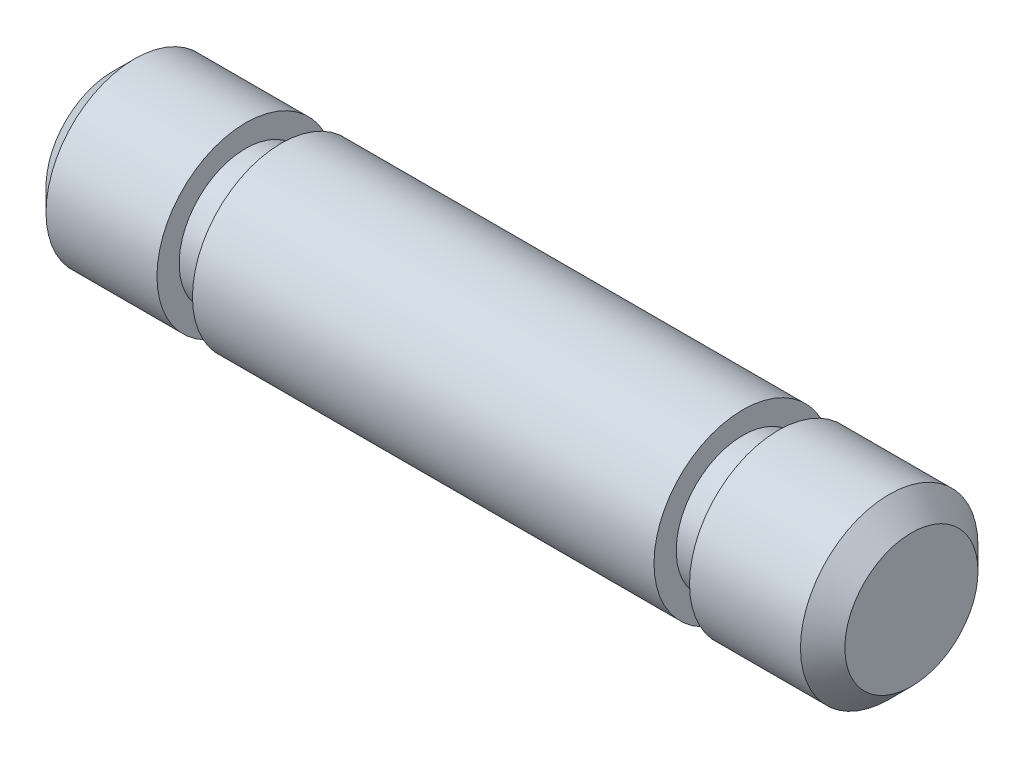
ISO-10303-21;
HEADER;
FILE_DESCRIPTION(('STEP AP214'),'2;1');
FILE_NAME('part.step','',(''),(''),'','','');
FILE_SCHEMA(('AUTOMOTIVE_DESIGN { 1 0 10303 214 1 1 1 1 }'));
ENDSEC;
DATA;
#1=APPLICATION_CONTEXT('core data for automotive mechanical design processes');
#2=APPLICATION_PROTOCOL_DEFINITION('international standard','automotive_design',2000,#1);
#3=PRODUCT_CONTEXT('',#1,'mechanical');
#4=PRODUCT('Part','Part','',(#3));
#5=PRODUCT_RELATED_PRODUCT_CATEGORY('part','',(#4));
#6=PRODUCT_DEFINITION_FORMATION('','',#4);
#7=PRODUCT_DEFINITION_CONTEXT('part definition',#1,'design');
#8=PRODUCT_DEFINITION('design','',#6,#7);
#9=PRODUCT_DEFINITION_SHAPE('','',#8);
#10=(LENGTH_UNIT() NAMED_UNIT(*) SI_UNIT(.MILLI.,.METRE.));
#11=(NAMED_UNIT(*) PLANE_ANGLE_UNIT() SI_UNIT($,.RADIAN.));
#12=(NAMED_UNIT(*) SI_UNIT($,.STERADIAN.) SOLID_ANGLE_UNIT());
#13=UNCERTAINTY_MEASURE_WITH_UNIT(LENGTH_MEASURE(1.E-05),#10,'distance_accuracy_value','');
#14=(GEOMETRIC_REPRESENTATION_CONTEXT(3) GLOBAL_UNCERTAINTY_ASSIGNED_CONTEXT((#13)) GLOBAL_UNIT_ASSIGNED_CONTEXT((#10,
#11,#12)) REPRESENTATION_CONTEXT('',''));
#15=CARTESIAN_POINT('',(0.,0.,0.));
#16=DIRECTION('',(0.,0.,1.));
#17=DIRECTION('',(1.,0.,0.));
#18=AXIS2_PLACEMENT_3D('',#15,#16,#17);
#19=CARTESIAN_POINT('',(9.,0.,0.));
#20=DIRECTION('',(-1.,0.,0.));
#21=DIRECTION('',(0.,0.,1.));
#22=AXIS2_PLACEMENT_3D('',#19,#20,#21);
#23=CYLINDRICAL_SURFACE('',#22,2.);
#24=CARTESIAN_POINT('',(5.2,0.,0.));
#25=DIRECTION('',(1.,0.,0.));
#26=DIRECTION('',(0.,0.,-1.));
#27=AXIS2_PLACEMENT_3D('',#24,#25,#26);
#28=CIRCLE('',#27,2.);
#29=CARTESIAN_POINT('',(5.2,0.,-2.));
#30=VERTEX_POINT('',#29);
#31=EDGE_CURVE('E51',#30,#30,#28,.T.);
#32=ORIENTED_EDGE('',*,*,#31,.F.);
#33=EDGE_LOOP('',(#32));
#34=FACE_BOUND('',#33,.T.);
#35=CARTESIAN_POINT('',(-5.2,0.,0.));
#36=DIRECTION('',(1.,0.,0.));
#37=DIRECTION('',(0.,0.,-1.));
#38=AXIS2_PLACEMENT_3D('',#35,#36,#37);
#39=CIRCLE('',#38,2.);
#40=CARTESIAN_POINT('',(-5.2,0.,-2.));
#41=VERTEX_POINT('',#40);
#42=EDGE_CURVE('E61',#41,#41,#39,.T.);
#43=ORIENTED_EDGE('',*,*,#42,.T.);
#44=EDGE_LOOP('',(#43));
#45=FACE_BOUND('',#44,.T.);
#46=ADVANCED_FACE('F31',(#34,#45),#23,.T.);
#47=CARTESIAN_POINT('',(5.2,0.,0.));
#48=DIRECTION('',(1.,0.,0.));
#49=DIRECTION('',(0.,0.,-1.));
#50=AXIS2_PLACEMENT_3D('',#47,#48,#49);
#51=PLANE('',#50);
#52=CARTESIAN_POINT('',(5.2,0.,0.));
#53=DIRECTION('',(1.,0.,0.));
#54=DIRECTION('',(0.,0.,-1.));
#55=AXIS2_PLACEMENT_3D('',#52,#53,#54);
#56=CIRCLE('',#55,1.5);
#57=CARTESIAN_POINT('',(5.2,0.,-1.5));
#58=VERTEX_POINT('',#57);
#59=EDGE_CURVE('E55',#58,#58,#56,.T.);
#60=ORIENTED_EDGE('',*,*,#59,.F.);
#61=EDGE_LOOP('',(#60));
#62=FACE_BOUND('',#61,.T.);
#63=ORIENTED_EDGE('',*,*,#31,.T.);
#64=EDGE_LOOP('',(#63));
#65=FACE_BOUND('',#64,.T.);
#66=ADVANCED_FACE('F97',(#62,#65),#51,.T.);
#67=CARTESIAN_POINT('',(6.,0.,0.));
#68=DIRECTION('',(1.,0.,0.));
#69=DIRECTION('',(0.,0.,-1.));
#70=AXIS2_PLACEMENT_3D('',#67,#68,#69);
#71=PLANE('',#70);
#72=CARTESIAN_POINT('',(6.,0.,0.));
#73=DIRECTION('',(1.,0.,0.));
#74=DIRECTION('',(0.,0.,-1.));
#75=AXIS2_PLACEMENT_3D('',#72,#73,#74);
#76=CIRCLE('',#75,1.5);
#77=CARTESIAN_POINT('',(6.,0.,-1.5));
#78=VERTEX_POINT('',#77);
#79=EDGE_CURVE('E58',#78,#78,#76,.T.);
#80=ORIENTED_EDGE('',*,*,#79,.T.);
#81=EDGE_LOOP('',(#80));
#82=FACE_BOUND('',#81,.T.);
#83=CARTESIAN_POINT('',(6.,0.,0.));
#84=DIRECTION('',(1.,0.,0.));
#85=DIRECTION('',(0.,0.,-1.));
#86=AXIS2_PLACEMENT_3D('',#83,#84,#85);
#87=CIRCLE('',#86,2.);
#88=CARTESIAN_POINT('',(6.,0.,-2.));
#89=VERTEX_POINT('',#88);
#90=EDGE_CURVE('E52',#89,#89,#87,.T.);
#91=ORIENTED_EDGE('',*,*,#90,.F.);
#92=EDGE_LOOP('',(#91));
#93=FACE_BOUND('',#92,.T.);
#94=ADVANCED_FACE('F104',(#82,#93),#71,.F.);
#95=CARTESIAN_POINT('',(5.2,0.,0.));
#96=DIRECTION('',(1.,0.,0.));
#97=DIRECTION('',(0.,0.,-1.));
#98=AXIS2_PLACEMENT_3D('',#95,#96,#97);
#99=CYLINDRICAL_SURFACE('',#98,1.5);
#100=ORIENTED_EDGE('',*,*,#59,.T.);
#101=EDGE_LOOP('',(#100));
#102=FACE_BOUND('',#101,.T.);
#103=ORIENTED_EDGE('',*,*,#79,.F.);
#104=EDGE_LOOP('',(#103));
#105=FACE_BOUND('',#104,.T.);
#106=ADVANCED_FACE('F126',(#102,#105),#99,.T.);
#107=CARTESIAN_POINT('',(9.,0.,0.));
#108=DIRECTION('',(1.,0.,0.));
#109=DIRECTION('',(0.,0.,-1.));
#110=AXIS2_PLACEMENT_3D('',#107,#108,#109);
#111=PLANE('',#110);
#112=CARTESIAN_POINT('',(9.,0.,0.));
#113=DIRECTION('',(1.,0.,0.));
#114=DIRECTION('',(0.,0.,-1.));
#115=AXIS2_PLACEMENT_3D('',#112,#113,#114);
#116=CIRCLE('',#115,1.5);
#117=CARTESIAN_POINT('',(9.,0.,-1.5));
#118=VERTEX_POINT('',#117);
#119=EDGE_CURVE('E10',#118,#118,#116,.T.);
#120=ORIENTED_EDGE('',*,*,#119,.T.);
#121=EDGE_LOOP('',(#120));
#122=FACE_BOUND('',#121,.T.);
#123=ADVANCED_FACE('F118',(#122),#111,.T.);
#124=CARTESIAN_POINT('',(9.,0.,0.));
#125=DIRECTION('',(-1.,0.,0.));
#126=DIRECTION('',(0.,0.,1.));
#127=AXIS2_PLACEMENT_3D('',#124,#125,#126);
#128=CONICAL_SURFACE('',#127,1.5,0.785398163397447);
#129=CARTESIAN_POINT('',(8.5,0.,0.));
#130=DIRECTION('',(1.,0.,0.));
#131=DIRECTION('',(0.,0.,-1.));
#132=AXIS2_PLACEMENT_3D('',#129,#130,#131);
#133=CIRCLE('',#132,2.);
#134=CARTESIAN_POINT('',(8.5,0.,-2.));
#135=VERTEX_POINT('',#134);
#136=EDGE_CURVE('E46',#135,#135,#133,.F.);
#137=ORIENTED_EDGE('',*,*,#136,.F.);
#138=EDGE_LOOP('',(#137));
#139=FACE_BOUND('',#138,.T.);
#140=ORIENTED_EDGE('',*,*,#119,.F.);
#141=EDGE_LOOP('',(#140));
#142=FACE_BOUND('',#141,.T.);
#143=ADVANCED_FACE('F33',(#139,#142),#128,.T.);
#144=ORIENTED_EDGE('',*,*,#90,.T.);
#145=EDGE_LOOP('',(#144));
#146=FACE_BOUND('',#145,.T.);
#147=ORIENTED_EDGE('',*,*,#136,.T.);
#148=EDGE_LOOP('',(#147));
#149=FACE_BOUND('',#148,.T.);
#150=ADVANCED_FACE('F92',(#146,#149),#23,.T.);
#151=CARTESIAN_POINT('',(-5.2,0.,0.));
#152=DIRECTION('',(-1.,0.,0.));
#153=DIRECTION('',(0.,0.,-1.));
#154=AXIS2_PLACEMENT_3D('',#151,#152,#153);
#155=PLANE('',#154);
#156=ORIENTED_EDGE('',*,*,#42,.F.);
#157=EDGE_LOOP('',(#156));
#158=FACE_BOUND('',#157,.T.);
#159=CARTESIAN_POINT('',(-5.2,0.,0.));
#160=DIRECTION('',(1.,0.,0.));
#161=DIRECTION('',(0.,0.,-1.));
#162=AXIS2_PLACEMENT_3D('',#159,#160,#161);
#163=CIRCLE('',#162,1.5);
#164=CARTESIAN_POINT('',(-5.2,0.,-1.5));
#165=VERTEX_POINT('',#164);
#166=EDGE_CURVE('E67',#165,#165,#163,.T.);
#167=ORIENTED_EDGE('',*,*,#166,.T.);
#168=EDGE_LOOP('',(#167));
#169=FACE_BOUND('',#168,.T.);
#170=ADVANCED_FACE('F76',(#158,#169),#155,.T.);
#171=CARTESIAN_POINT('',(-6.,0.,0.));
#172=DIRECTION('',(-1.,0.,0.));
#173=DIRECTION('',(0.,0.,-1.));
#174=AXIS2_PLACEMENT_3D('',#171,#172,#173);
#175=PLANE('',#174);
#176=CARTESIAN_POINT('',(-6.,0.,0.));
#177=DIRECTION('',(1.,0.,0.));
#178=DIRECTION('',(0.,0.,-1.));
#179=AXIS2_PLACEMENT_3D('',#176,#177,#178);
#180=CIRCLE('',#179,2.);
#181=CARTESIAN_POINT('',(-6.,0.,-2.));
#182=VERTEX_POINT('',#181);
#183=EDGE_CURVE('E64',#182,#182,#180,.T.);
#184=ORIENTED_EDGE('',*,*,#183,.T.);
#185=EDGE_LOOP('',(#184));
#186=FACE_BOUND('',#185,.T.);
#187=CARTESIAN_POINT('',(-6.,0.,0.));
#188=DIRECTION('',(1.,0.,0.));
#189=DIRECTION('',(0.,0.,-1.));
#190=AXIS2_PLACEMENT_3D('',#187,#188,#189);
#191=CIRCLE('',#190,1.5);
#192=CARTESIAN_POINT('',(-6.,0.,-1.5));
#193=VERTEX_POINT('',#192);
#194=EDGE_CURVE('E70',#193,#193,#191,.T.);
#195=ORIENTED_EDGE('',*,*,#194,.F.);
#196=EDGE_LOOP('',(#195));
#197=FACE_BOUND('',#196,.T.);
#198=ADVANCED_FACE('F82',(#186,#197),#175,.F.);
#199=CARTESIAN_POINT('',(-5.2,0.,0.));
#200=DIRECTION('',(-1.,0.,0.));
#201=DIRECTION('',(0.,0.,1.));
#202=AXIS2_PLACEMENT_3D('',#199,#200,#201);
#203=CYLINDRICAL_SURFACE('',#202,1.5);
#204=ORIENTED_EDGE('',*,*,#166,.F.);
#205=EDGE_LOOP('',(#204));
#206=FACE_BOUND('',#205,.T.);
#207=ORIENTED_EDGE('',*,*,#194,.T.);
#208=EDGE_LOOP('',(#207));
#209=FACE_BOUND('',#208,.T.);
#210=ADVANCED_FACE('F78',(#206,#209),#203,.T.);
#211=CARTESIAN_POINT('',(-9.,0.,0.));
#212=DIRECTION('',(1.,0.,0.));
#213=DIRECTION('',(0.,0.,-1.));
#214=AXIS2_PLACEMENT_3D('',#211,#212,#213);
#215=PLANE('',#214);
#216=CARTESIAN_POINT('',(-9.,0.,0.));
#217=DIRECTION('',(1.,0.,0.));
#218=DIRECTION('',(0.,0.,-1.));
#219=AXIS2_PLACEMENT_3D('',#216,#217,#218);
#220=CIRCLE('',#219,1.49999999999999);
#221=CARTESIAN_POINT('',(-9.,0.,-1.49999999999999));
#222=VERTEX_POINT('',#221);
#223=EDGE_CURVE('E38',#222,#222,#220,.F.);
#224=ORIENTED_EDGE('',*,*,#223,.T.);
#225=EDGE_LOOP('',(#224));
#226=FACE_BOUND('',#225,.T.);
#227=ADVANCED_FACE('F81',(#226),#215,.F.);
#228=CARTESIAN_POINT('',(-8.49999999999999,0.,0.));
#229=DIRECTION('',(1.,0.,0.));
#230=DIRECTION('',(0.,0.,-1.));
#231=AXIS2_PLACEMENT_3D('',#228,#229,#230);
#232=CONICAL_SURFACE('',#231,2.,0.785398163397447);
#233=ORIENTED_EDGE('',*,*,#223,.F.);
#234=EDGE_LOOP('',(#233));
#235=FACE_BOUND('',#234,.T.);
#236=CARTESIAN_POINT('',(-8.49999999999999,0.,0.));
#237=DIRECTION('',(1.,0.,0.));
#238=DIRECTION('',(0.,0.,-1.));
#239=AXIS2_PLACEMENT_3D('',#236,#237,#238);
#240=CIRCLE('',#239,2.);
#241=CARTESIAN_POINT('',(-8.49999999999999,0.,-2.));
#242=VERTEX_POINT('',#241);
#243=EDGE_CURVE('E42',#242,#242,#240,.T.);
#244=ORIENTED_EDGE('',*,*,#243,.F.);
#245=EDGE_LOOP('',(#244));
#246=FACE_BOUND('',#245,.T.);
#247=ADVANCED_FACE('F111',(#235,#246),#232,.T.);
#248=ORIENTED_EDGE('',*,*,#183,.F.);
#249=EDGE_LOOP('',(#248));
#250=FACE_BOUND('',#249,.T.);
#251=ORIENTED_EDGE('',*,*,#243,.T.);
#252=EDGE_LOOP('',(#251));
#253=FACE_BOUND('',#252,.T.);
#254=ADVANCED_FACE('F100',(#250,#253),#23,.T.);
#255=CLOSED_SHELL('',(#46,#66,#94,#106,#123,#143,#150,#170,#198,#210,#227,#247,#254));
#256=MANIFOLD_SOLID_BREP('B2',#255);
#257=ADVANCED_BREP_SHAPE_REPRESENTATION('',(#18,#256),#14);
#258=SHAPE_DEFINITION_REPRESENTATION(#9,#257);
ENDSEC;
END-ISO-10303-21;
